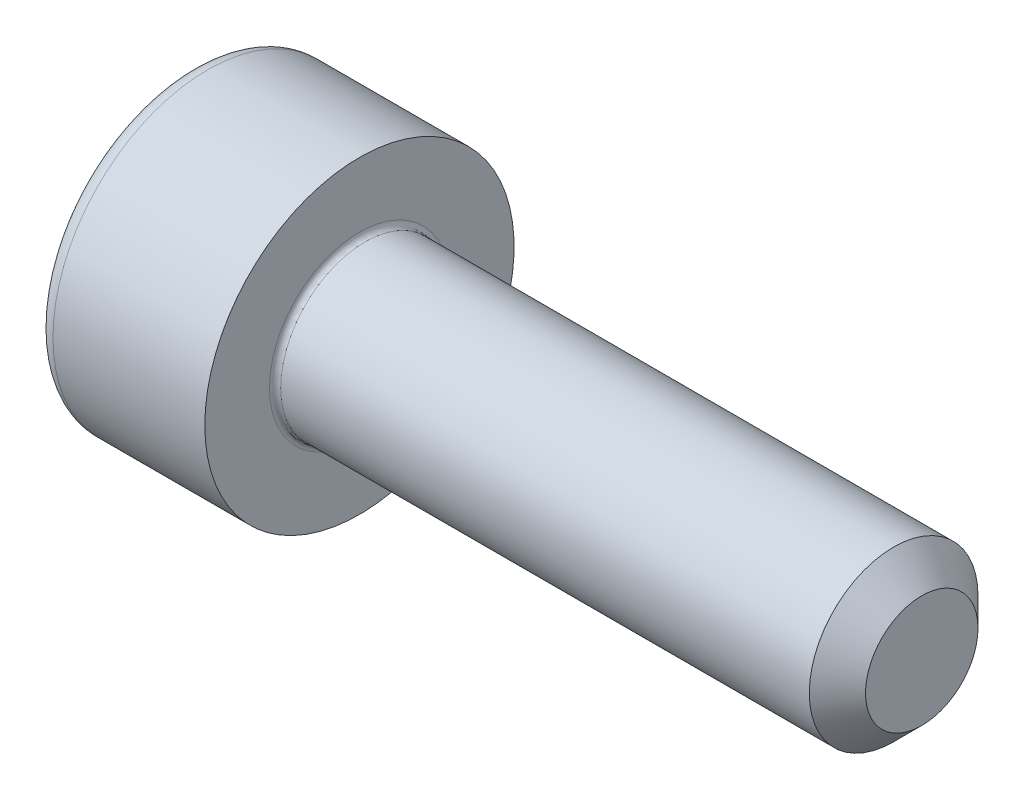
ISO-10303-21;
HEADER;
FILE_DESCRIPTION(('STEP AP214'),'2;1');
FILE_NAME('part.step','',(''),(''),'','','');
FILE_SCHEMA(('AUTOMOTIVE_DESIGN { 1 0 10303 214 1 1 1 1 }'));
ENDSEC;
DATA;
#1=APPLICATION_CONTEXT('core data for automotive mechanical design processes');
#2=APPLICATION_PROTOCOL_DEFINITION('international standard','automotive_design',2000,#1);
#3=PRODUCT_CONTEXT('',#1,'mechanical');
#4=PRODUCT('Part','Part','',(#3));
#5=PRODUCT_RELATED_PRODUCT_CATEGORY('part','',(#4));
#6=PRODUCT_DEFINITION_FORMATION('','',#4);
#7=PRODUCT_DEFINITION_CONTEXT('part definition',#1,'design');
#8=PRODUCT_DEFINITION('design','',#6,#7);
#9=PRODUCT_DEFINITION_SHAPE('','',#8);
#10=(LENGTH_UNIT() NAMED_UNIT(*) SI_UNIT(.MILLI.,.METRE.));
#11=(NAMED_UNIT(*) PLANE_ANGLE_UNIT() SI_UNIT($,.RADIAN.));
#12=(NAMED_UNIT(*) SI_UNIT($,.STERADIAN.) SOLID_ANGLE_UNIT());
#13=UNCERTAINTY_MEASURE_WITH_UNIT(LENGTH_MEASURE(1.E-05),#10,'distance_accuracy_value','');
#14=(GEOMETRIC_REPRESENTATION_CONTEXT(3) GLOBAL_UNCERTAINTY_ASSIGNED_CONTEXT((#13)) GLOBAL_UNIT_ASSIGNED_CONTEXT((#10,
#11,#12)) REPRESENTATION_CONTEXT('',''));
#15=CARTESIAN_POINT('',(0.,0.,0.));
#16=DIRECTION('',(0.,0.,1.));
#17=DIRECTION('',(1.,0.,0.));
#18=AXIS2_PLACEMENT_3D('',#15,#16,#17);
#19=CARTESIAN_POINT('',(0.1,0.,0.));
#20=DIRECTION('',(1.,0.,0.));
#21=DIRECTION('',(0.,-1.,0.));
#22=AXIS2_PLACEMENT_3D('',#19,#20,#21);
#23=TOROIDAL_SURFACE('',#22,1.6,0.1);
#24=CARTESIAN_POINT('',(0.,0.,0.));
#25=DIRECTION('',(1.,0.,0.));
#26=DIRECTION('',(0.,-1.,0.));
#27=AXIS2_PLACEMENT_3D('',#24,#25,#26);
#28=CIRCLE('',#27,1.6);
#29=CARTESIAN_POINT('',(0.,-1.6,0.));
#30=VERTEX_POINT('',#29);
#31=EDGE_CURVE('E210',#30,#30,#28,.T.);
#32=ORIENTED_EDGE('',*,*,#31,.T.);
#33=EDGE_LOOP('',(#32));
#34=FACE_BOUND('',#33,.T.);
#35=CARTESIAN_POINT('',(0.1,0.,0.));
#36=DIRECTION('',(-1.,0.,0.));
#37=DIRECTION('',(0.,0.,1.));
#38=AXIS2_PLACEMENT_3D('',#35,#36,#37);
#39=CIRCLE('',#38,1.5);
#40=CARTESIAN_POINT('',(0.1,0.,1.5));
#41=VERTEX_POINT('',#40);
#42=EDGE_CURVE('E211',#41,#41,#39,.T.);
#43=ORIENTED_EDGE('',*,*,#42,.T.);
#44=EDGE_LOOP('',(#43));
#45=FACE_BOUND('',#44,.T.);
#46=ADVANCED_FACE('F60',(#34,#45),#23,.F.);
#47=CARTESIAN_POINT('',(-2.7,0.,0.));
#48=DIRECTION('',(1.,0.,0.));
#49=DIRECTION('',(0.,0.,1.));
#50=AXIS2_PLACEMENT_3D('',#47,#48,#49);
#51=TOROIDAL_SURFACE('',#50,2.45,0.3);
#52=CARTESIAN_POINT('',(-3.,0.,0.));
#53=DIRECTION('',(1.,0.,0.));
#54=DIRECTION('',(0.,0.,1.));
#55=AXIS2_PLACEMENT_3D('',#52,#53,#54);
#56=CIRCLE('',#55,2.45);
#57=CARTESIAN_POINT('',(-3.,0.,2.45));
#58=VERTEX_POINT('',#57);
#59=EDGE_CURVE('E195',#58,#58,#56,.T.);
#60=ORIENTED_EDGE('',*,*,#59,.T.);
#61=EDGE_LOOP('',(#60));
#62=FACE_BOUND('',#61,.T.);
#63=CARTESIAN_POINT('',(-2.7,0.,0.));
#64=DIRECTION('',(1.,0.,0.));
#65=DIRECTION('',(0.,0.,1.));
#66=AXIS2_PLACEMENT_3D('',#63,#64,#65);
#67=CIRCLE('',#66,2.75);
#68=CARTESIAN_POINT('',(-2.7,0.,2.75));
#69=VERTEX_POINT('',#68);
#70=EDGE_CURVE('E201',#69,#69,#67,.T.);
#71=ORIENTED_EDGE('',*,*,#70,.F.);
#72=EDGE_LOOP('',(#71));
#73=FACE_BOUND('',#72,.T.);
#74=ADVANCED_FACE('F228',(#62,#73),#51,.T.);
#75=CARTESIAN_POINT('',(0.,0.,0.));
#76=DIRECTION('',(1.,0.,0.));
#77=DIRECTION('',(0.,0.,1.));
#78=AXIS2_PLACEMENT_3D('',#75,#76,#77);
#79=PLANE('',#78);
#80=ORIENTED_EDGE('',*,*,#31,.F.);
#81=EDGE_LOOP('',(#80));
#82=FACE_BOUND('',#81,.T.);
#83=CARTESIAN_POINT('',(0.,0.,0.));
#84=DIRECTION('',(1.,0.,0.));
#85=DIRECTION('',(0.,0.,1.));
#86=AXIS2_PLACEMENT_3D('',#83,#84,#85);
#87=CIRCLE('',#86,2.75);
#88=CARTESIAN_POINT('',(0.,0.,2.75));
#89=VERTEX_POINT('',#88);
#90=EDGE_CURVE('E197',#89,#89,#87,.T.);
#91=ORIENTED_EDGE('',*,*,#90,.T.);
#92=EDGE_LOOP('',(#91));
#93=FACE_BOUND('',#92,.T.);
#94=ADVANCED_FACE('F237',(#82,#93),#79,.T.);
#95=CARTESIAN_POINT('',(-3.,0.,0.));
#96=DIRECTION('',(1.,0.,0.));
#97=DIRECTION('',(0.,0.,1.));
#98=AXIS2_PLACEMENT_3D('',#95,#96,#97);
#99=CYLINDRICAL_SURFACE('',#98,2.75);
#100=ORIENTED_EDGE('',*,*,#70,.T.);
#101=EDGE_LOOP('',(#100));
#102=FACE_BOUND('',#101,.T.);
#103=ORIENTED_EDGE('',*,*,#90,.F.);
#104=EDGE_LOOP('',(#103));
#105=FACE_BOUND('',#104,.T.);
#106=ADVANCED_FACE('F265',(#102,#105),#99,.T.);
#107=CARTESIAN_POINT('',(0.133333333289239,-1.25,0.721687836487034));
#108=DIRECTION('',(0.,-0.5,0.866025403784439));
#109=DIRECTION('',(0.,0.866025403784439,0.5));
#110=AXIS2_PLACEMENT_3D('',#107,#108,#109);
#111=PLANE('',#110);
#112=CARTESIAN_POINT('',(-1.69999999999987,-1.25,0.721687836487035));
#113=CARTESIAN_POINT('',(-1.69738401948294,-1.24215203932499,0.726218858695339));
#114=CARTESIAN_POINT('',(-1.6922165499147,-1.22642783397098,0.735297232889276));
#115=CARTESIAN_POINT('',(-1.6846713619674,-1.20276898058198,0.748956678262127));
#116=CARTESIAN_POINT('',(-1.67733392896537,-1.17901516334059,0.762670951040728));
#117=CARTESIAN_POINT('',(-1.67021338001789,-1.15516514334506,0.776440766505325));
#118=CARTESIAN_POINT('',(-1.66253768859292,-1.12850348333736,0.791833883087814));
#119=CARTESIAN_POINT('',(-1.65367463731152,-1.09628003852828,0.810438097622551));
#120=CARTESIAN_POINT('',(-1.64360384312695,-1.05722065582976,0.832989042737921));
#121=CARTESIAN_POINT('',(-1.63372595374146,-1.01552255276089,0.857063453769432));
#122=CARTESIAN_POINT('',(-1.62415304160412,-0.971037529922755,0.882746893679936));
#123=CARTESIAN_POINT('',(-1.61437860911247,-0.920014398444216,0.912205112373968));
#124=CARTESIAN_POINT('',(-1.60493575093948,-0.861148465760758,0.94619137445486));
#125=CARTESIAN_POINT('',(-1.59763295469434,-0.802112128018892,0.980276019942097));
#126=CARTESIAN_POINT('',(-1.59322233484196,-0.753207018638113,1.00851139800784));
#127=CARTESIAN_POINT('',(-1.59067705349734,-0.71409478336521,1.03109285757126));
#128=CARTESIAN_POINT('',(-1.58915372065229,-0.679736799705594,1.05092944868595));
#129=CARTESIAN_POINT('',(-1.58834848889278,-0.644843445143961,1.07107513633504));
#130=CARTESIAN_POINT('',(-1.58829905866402,-0.609392767050834,1.09154259487506));
#131=CARTESIAN_POINT('',(-1.58903450088332,-0.573624128278051,1.11219362809907));
#132=CARTESIAN_POINT('',(-1.59056900030582,-0.537634757313027,1.13297210111369));
#133=CARTESIAN_POINT('',(-1.59289700232276,-0.501605681203261,1.15377349790432));
#134=CARTESIAN_POINT('',(-1.59601207891327,-0.465548040949067,1.17459138621142));
#135=CARTESIAN_POINT('',(-1.5999027213972,-0.429490466158829,1.19540923672289));
#136=CARTESIAN_POINT('',(-1.60455788341784,-0.393424641510312,1.21623185029226));
#137=CARTESIAN_POINT('',(-1.60995884670772,-0.357380152398952,1.2370421457835));
#138=CARTESIAN_POINT('',(-1.61608835380497,-0.321356169143508,1.25784060221332));
#139=CARTESIAN_POINT('',(-1.62292110031353,-0.285384285521163,1.27860897890593));
#140=CARTESIAN_POINT('',(-1.63043333920983,-0.249471247576269,1.29934338103084));
#141=CARTESIAN_POINT('',(-1.63859848012798,-0.213629543182003,1.32003659871108));
#142=CARTESIAN_POINT('',(-1.64739518608139,-0.17784538919857,1.34069658964614));
#143=CARTESIAN_POINT('',(-1.65679600883554,-0.142129567892932,1.36131712869128));
#144=CARTESIAN_POINT('',(-1.66677755965338,-0.10647502690417,1.38190228752897));
#145=CARTESIAN_POINT('',(-1.67731135856734,-0.0708929602258874,1.402445603304));
#146=CARTESIAN_POINT('',(-1.68837275186723,-0.0353810996675898,1.42294838555676));
#147=CARTESIAN_POINT('',(-1.69607201648135,-0.0117840267349489,1.43657216196651));
#148=CARTESIAN_POINT('',(-1.69999999999987,0.,1.44337567297407));
#149=B_SPLINE_CURVE_WITH_KNOTS('',3,(#112,#113,#114,#115,#116,#117,#118,#119,#120,#121,#122,
#123,#124,#125,#126,#127,#128,#129,#130,#131,#132,#133,#134,#135,#136,#137,#138,#139,#140,#141,
#142,#143,#144,#145,#146,#147,#148),.UNSPECIFIED.,.F.,.F.,(4,1,1,1,1,1,1,1,1,1,1,1,1,1,1,1,1,1,
1,1,1,1,1,1,1,1,1,1,1,1,1,1,1,1,4),(0.,0.0193286094422815,0.0386758778059963,0.0580433526518195,
0.0774601551828898,0.0969018530867074,0.122980681924948,0.155735511331439,0.191472868184122,
0.223581141428566,0.262696925229055,0.31374010739609,0.364073010828582,0.403001156408343,
0.429649119201364,0.456644552348079,0.48425991734535,0.51213956948865,0.54044675371789,
0.568839006632917,0.597298408954167,0.625777869427183,0.65433651245964,0.682914884875453,
0.711553298380966,0.740225079816359,0.768942792806602,0.797668936453434,0.826435603416019,
0.855234706304396,0.884091922636723,0.912980528265628,0.941935664746071,0.970940011129428,1.),.UNSPECIFIED.);
#150=CARTESIAN_POINT('',(-1.69999999999982,-1.25,0.721687836487035));
#151=VERTEX_POINT('',#150);
#152=CARTESIAN_POINT('',(-1.69999999999973,0.,1.44337567297407));
#153=VERTEX_POINT('',#152);
#154=EDGE_CURVE('E163',#151,#153,#149,.T.);
#155=ORIENTED_EDGE('',*,*,#154,.F.);
#156=DIRECTION('',(-1.,0.,0.));
#157=VECTOR('',#156,1.);
#158=CARTESIAN_POINT('',(-1.69999999999973,-1.25,0.721687836487034));
#159=LINE('',#158,#157);
#160=CARTESIAN_POINT('',(-3.,-1.25,0.721687836487033));
#161=VERTEX_POINT('',#160);
#162=EDGE_CURVE('E182',#151,#161,#159,.T.);
#163=ORIENTED_EDGE('',*,*,#162,.T.);
#164=DIRECTION('',(0.,0.866025403784439,0.5));
#165=VECTOR('',#164,1.);
#166=CARTESIAN_POINT('',(-3.,-1.25,0.721687836487034));
#167=LINE('',#166,#165);
#168=CARTESIAN_POINT('',(-3.,0.,1.44337567297407));
#169=VERTEX_POINT('',#168);
#170=EDGE_CURVE('E189',#161,#169,#167,.T.);
#171=ORIENTED_EDGE('',*,*,#170,.T.);
#172=DIRECTION('',(-1.,0.,0.));
#173=VECTOR('',#172,1.);
#174=CARTESIAN_POINT('',(-1.69999999999973,0.,1.44337567297407));
#175=LINE('',#174,#173);
#176=EDGE_CURVE('E126',#153,#169,#175,.T.);
#177=ORIENTED_EDGE('',*,*,#176,.F.);
#178=EDGE_LOOP('',(#155,#163,#171,#177));
#179=FACE_BOUND('',#178,.T.);
#180=ADVANCED_FACE('F258',(#179),#111,.F.);
#181=CARTESIAN_POINT('',(0.133333333289239,0.,1.44337567297407));
#182=DIRECTION('',(0.,0.5,0.866025403784439));
#183=DIRECTION('',(0.,0.866025403784439,-0.5));
#184=AXIS2_PLACEMENT_3D('',#181,#182,#183);
#185=PLANE('',#184);
#186=CARTESIAN_POINT('',(-1.69999999999987,0.,1.44337567297407));
#187=CARTESIAN_POINT('',(-1.69738401948294,0.00784796067500621,1.43884465076576));
#188=CARTESIAN_POINT('',(-1.6922165499147,0.0235721660290274,1.42976627657183));
#189=CARTESIAN_POINT('',(-1.6846713619674,0.0472310194180179,1.41610683119898));
#190=CARTESIAN_POINT('',(-1.67733392896537,0.0709848366594086,1.40239255842038));
#191=CARTESIAN_POINT('',(-1.67021338001789,0.0948348566549364,1.38862274295578));
#192=CARTESIAN_POINT('',(-1.66253768859292,0.121496516662632,1.3732296263733));
#193=CARTESIAN_POINT('',(-1.65367463731152,0.153719961471703,1.35462541183856));
#194=CARTESIAN_POINT('',(-1.64360384312696,0.192779344170216,1.3320744667232));
#195=CARTESIAN_POINT('',(-1.63372595374147,0.234477447239084,1.30800005569169));
#196=CARTESIAN_POINT('',(-1.62415304160413,0.278962470077212,1.28231661578119));
#197=CARTESIAN_POINT('',(-1.61437860911248,0.329985601555743,1.25285839708716));
#198=CARTESIAN_POINT('',(-1.60493575093949,0.38885153423919,1.21887213500627));
#199=CARTESIAN_POINT('',(-1.59763295469434,0.447887871981046,1.18478748951904));
#200=CARTESIAN_POINT('',(-1.59322233484197,0.496792981361817,1.15655211145331));
#201=CARTESIAN_POINT('',(-1.59067705349735,0.535905216634715,1.13397065188989));
#202=CARTESIAN_POINT('',(-1.58915372065229,0.570263200294327,1.1141340607752));
#203=CARTESIAN_POINT('',(-1.58834848889279,0.605156554855955,1.09398837312612));
#204=CARTESIAN_POINT('',(-1.58829905866402,0.640607232949079,1.0735209145861));
#205=CARTESIAN_POINT('',(-1.58903450088332,0.676375871721859,1.05286988136209));
#206=CARTESIAN_POINT('',(-1.59056900030581,0.712365242686879,1.03209140834747));
#207=CARTESIAN_POINT('',(-1.59289700232275,0.748394318796646,1.01129001155684));
#208=CARTESIAN_POINT('',(-1.59601207891326,0.784451959050839,0.990472123249737));
#209=CARTESIAN_POINT('',(-1.59990272139718,0.820509533841079,0.969654272738267));
#210=CARTESIAN_POINT('',(-1.60455788341783,0.856575358489599,0.948831659168899));
#211=CARTESIAN_POINT('',(-1.6099588467077,0.892619847600962,0.92802136367765));
#212=CARTESIAN_POINT('',(-1.61608835380496,0.928643830856412,0.907222907247834));
#213=CARTESIAN_POINT('',(-1.62292110031352,0.964615714478762,0.886454530555211));
#214=CARTESIAN_POINT('',(-1.63043333920981,1.00052875242366,0.865720128430306));
#215=CARTESIAN_POINT('',(-1.63859848012796,1.03637045681794,0.845026910750056));
#216=CARTESIAN_POINT('',(-1.64739518608137,1.07215461080138,0.824366919814993));
#217=CARTESIAN_POINT('',(-1.65679600883552,1.10787043210703,0.803746380769848));
#218=CARTESIAN_POINT('',(-1.66677755965337,1.1435249730958,0.783161221932148));
#219=CARTESIAN_POINT('',(-1.67731135856734,1.17910703977409,0.762617906157113));
#220=CARTESIAN_POINT('',(-1.68837275186723,1.2146189003324,0.742115123904349));
#221=CARTESIAN_POINT('',(-1.69607201648135,1.23821597326505,0.728491347494598));
#222=CARTESIAN_POINT('',(-1.69999999999986,1.25,0.721687836487037));
#223=B_SPLINE_CURVE_WITH_KNOTS('',3,(#186,#187,#188,#189,#190,#191,#192,#193,#194,#195,#196,
#197,#198,#199,#200,#201,#202,#203,#204,#205,#206,#207,#208,#209,#210,#211,#212,#213,#214,#215,
#216,#217,#218,#219,#220,#221,#222),.UNSPECIFIED.,.F.,.F.,(4,1,1,1,1,1,1,1,1,1,1,1,1,1,1,1,1,1,
1,1,1,1,1,1,1,1,1,1,1,1,1,1,1,1,4),(0.,0.0193286094422852,0.038675877805997,0.0580433526518165,
0.0774601551828836,0.096901853086698,0.122980681924932,0.155735511331419,0.191472868184097,
0.223581141428535,0.26269692522902,0.313740107396046,0.364073010828529,0.403001156408285,
0.429649119201302,0.456644552348014,0.484259917345281,0.512139569488578,0.540446753717816,
0.56883900663284,0.59729840895409,0.625777869427106,0.654336512459564,0.68291488487538,
0.711553298380895,0.740225079816292,0.768942792806539,0.797668936453377,0.82643560341597,
0.855234706304354,0.884091922636689,0.912980528265602,0.941935664746054,0.97094001112942,1.),.UNSPECIFIED.);
#224=CARTESIAN_POINT('',(-1.69999999999981,1.25,0.721687836487036));
#225=VERTEX_POINT('',#224);
#226=EDGE_CURVE('E161',#153,#225,#223,.T.);
#227=ORIENTED_EDGE('',*,*,#226,.F.);
#228=ORIENTED_EDGE('',*,*,#176,.T.);
#229=DIRECTION('',(0.,0.866025403784439,-0.5));
#230=VECTOR('',#229,1.);
#231=CARTESIAN_POINT('',(-3.,0.,1.44337567297407));
#232=LINE('',#231,#230);
#233=CARTESIAN_POINT('',(-3.,1.25,0.721687836487037));
#234=VERTEX_POINT('',#233);
#235=EDGE_CURVE('E134',#169,#234,#232,.T.);
#236=ORIENTED_EDGE('',*,*,#235,.T.);
#237=DIRECTION('',(-1.,0.,0.));
#238=VECTOR('',#237,1.);
#239=CARTESIAN_POINT('',(-1.69999999999973,1.25,0.721687836487036));
#240=LINE('',#239,#238);
#241=EDGE_CURVE('E116',#225,#234,#240,.T.);
#242=ORIENTED_EDGE('',*,*,#241,.F.);
#243=EDGE_LOOP('',(#227,#228,#236,#242));
#244=FACE_BOUND('',#243,.T.);
#245=ADVANCED_FACE('F133',(#244),#185,.F.);
#246=CARTESIAN_POINT('',(0.133333333289239,1.25,0.721687836487036));
#247=DIRECTION('',(0.,1.,0.));
#248=DIRECTION('',(0.,0.,-1.));
#249=AXIS2_PLACEMENT_3D('',#246,#247,#248);
#250=PLANE('',#249);
#251=CARTESIAN_POINT('',(-1.69999999999986,1.25,0.721687836487036));
#252=CARTESIAN_POINT('',(-1.69738401948294,1.25,0.712625792070429));
#253=CARTESIAN_POINT('',(-1.6922165499147,1.25,0.694469043682561));
#254=CARTESIAN_POINT('',(-1.6846713619674,1.25,0.667150152936864));
#255=CARTESIAN_POINT('',(-1.67733392896537,1.25,0.639721607379672));
#256=CARTESIAN_POINT('',(-1.67021338001789,1.25,0.612181976450485));
#257=CARTESIAN_POINT('',(-1.66253768859292,1.25,0.581395743285518));
#258=CARTESIAN_POINT('',(-1.65367463731153,1.25,0.544187314216054));
#259=CARTESIAN_POINT('',(-1.64360384312696,1.25,0.499085423985328));
#260=CARTESIAN_POINT('',(-1.63372595374147,1.25,0.450936601922322));
#261=CARTESIAN_POINT('',(-1.62415304160414,1.25,0.399569722101333));
#262=CARTESIAN_POINT('',(-1.61437860911249,1.25,0.340653284713289));
#263=CARTESIAN_POINT('',(-1.6049357509395,1.25,0.272680760551531));
#264=CARTESIAN_POINT('',(-1.59763295469435,1.25,0.204511469577086));
#265=CARTESIAN_POINT('',(-1.59322233484197,1.25,0.148040713445626));
#266=CARTESIAN_POINT('',(-1.59067705349735,1.25,0.102877794318804));
#267=CARTESIAN_POINT('',(-1.58915372065229,1.25,0.0632046120894322));
#268=CARTESIAN_POINT('',(-1.58834848889278,1.25,0.0229132367912671));
#269=CARTESIAN_POINT('',(-1.58829905866402,1.25,-0.0180216802887679));
#270=CARTESIAN_POINT('',(-1.58903450088331,1.25,-0.0593237467367864));
#271=CARTESIAN_POINT('',(-1.5905690003058,1.25,-0.100880692766023));
#272=CARTESIAN_POINT('',(-1.59289700232274,1.25,-0.142483486347277));
#273=CARTESIAN_POINT('',(-1.59601207891324,1.25,-0.18411926296148));
#274=CARTESIAN_POINT('',(-1.59990272139717,1.25,-0.225754963984424));
#275=CARTESIAN_POINT('',(-1.60455788341781,1.25,-0.267400191123166));
#276=CARTESIAN_POINT('',(-1.60995884670768,1.25,-0.309020782105669));
#277=CARTESIAN_POINT('',(-1.61608835380494,1.25,-0.350617694965311));
#278=CARTESIAN_POINT('',(-1.6229211003135,1.25,-0.392154448350565));
#279=CARTESIAN_POINT('',(-1.63043333920979,1.25,-0.433623252600389));
#280=CARTESIAN_POINT('',(-1.63859848012794,1.25,-0.475009687960901));
#281=CARTESIAN_POINT('',(-1.64739518608136,1.25,-0.516329669831042));
#282=CARTESIAN_POINT('',(-1.65679600883551,1.25,-0.557570747921346));
#283=CARTESIAN_POINT('',(-1.66677755965335,1.25,-0.598741065596762));
#284=CARTESIAN_POINT('',(-1.67731135856733,1.25,-0.63982769714685));
#285=CARTESIAN_POINT('',(-1.68837275186722,1.25,-0.680833261652393));
#286=CARTESIAN_POINT('',(-1.69607201648135,1.25,-0.708080814471907));
#287=CARTESIAN_POINT('',(-1.69999999999986,1.25,-0.721687836487034));
#288=B_SPLINE_CURVE_WITH_KNOTS('',3,(#251,#252,#253,#254,#255,#256,#257,#258,#259,#260,#261,
#262,#263,#264,#265,#266,#267,#268,#269,#270,#271,#272,#273,#274,#275,#276,#277,#278,#279,#280,
#281,#282,#283,#284,#285,#286,#287),.UNSPECIFIED.,.F.,.F.,(4,1,1,1,1,1,1,1,1,1,1,1,1,1,1,1,1,1,
1,1,1,1,1,1,1,1,1,1,1,1,1,1,1,1,4),(0.,0.0193286094422788,0.0386758778059875,0.0580433526518041,
0.0774601551828686,0.0969018530866802,0.122980681924911,0.155735511331393,0.191472868184064,
0.223581141428496,0.262696925228972,0.313740107395987,0.364073010828459,0.403001156408204,
0.429649119201216,0.456644552347923,0.484259917345186,0.51213956948848,0.540446753717715,
0.568839006632737,0.597298408953986,0.625777869427002,0.654336512459462,0.68291488487528,
0.7115532983808,0.740225079816202,0.768942792806457,0.797668936453302,0.826435603415904,
0.855234706304297,0.884091922636643,0.912980528265567,0.941935664746031,0.970940011129409,1.),.UNSPECIFIED.);
#289=CARTESIAN_POINT('',(-1.69999999999981,1.25,-0.721687836487034));
#290=VERTEX_POINT('',#289);
#291=EDGE_CURVE('E121',#225,#290,#288,.T.);
#292=ORIENTED_EDGE('',*,*,#291,.F.);
#293=ORIENTED_EDGE('',*,*,#241,.T.);
#294=DIRECTION('',(0.,0.,-1.));
#295=VECTOR('',#294,1.);
#296=CARTESIAN_POINT('',(-3.,1.25,0.721687836487036));
#297=LINE('',#296,#295);
#298=CARTESIAN_POINT('',(-3.,1.25,-0.721687836487035));
#299=VERTEX_POINT('',#298);
#300=EDGE_CURVE('E120',#234,#299,#297,.T.);
#301=ORIENTED_EDGE('',*,*,#300,.T.);
#302=DIRECTION('',(-1.,0.,0.));
#303=VECTOR('',#302,1.);
#304=CARTESIAN_POINT('',(-1.69999999999973,1.25,-0.721687836487034));
#305=LINE('',#304,#303);
#306=EDGE_CURVE('E129',#290,#299,#305,.T.);
#307=ORIENTED_EDGE('',*,*,#306,.F.);
#308=EDGE_LOOP('',(#292,#293,#301,#307));
#309=FACE_BOUND('',#308,.T.);
#310=ADVANCED_FACE('F119',(#309),#250,.F.);
#311=CARTESIAN_POINT('',(0.133333333289239,1.25,-0.721687836487034));
#312=DIRECTION('',(0.,0.5,-0.866025403784439));
#313=DIRECTION('',(0.,-0.866025403784439,-0.5));
#314=AXIS2_PLACEMENT_3D('',#311,#312,#313);
#315=PLANE('',#314);
#316=CARTESIAN_POINT('',(-1.69999999999986,1.25,-0.721687836487034));
#317=CARTESIAN_POINT('',(-1.69738401948294,1.24215203932499,-0.726218858695339));
#318=CARTESIAN_POINT('',(-1.6922165499147,1.22642783397097,-0.735297232889276));
#319=CARTESIAN_POINT('',(-1.6846713619674,1.20276898058198,-0.748956678262131));
#320=CARTESIAN_POINT('',(-1.67733392896536,1.17901516334058,-0.762670951040733));
#321=CARTESIAN_POINT('',(-1.67021338001788,1.15516514334504,-0.776440766505336));
#322=CARTESIAN_POINT('',(-1.66253768859291,1.12850348333733,-0.791833883087827));
#323=CARTESIAN_POINT('',(-1.65367463731151,1.09628003852824,-0.81043809762257));
#324=CARTESIAN_POINT('',(-1.64360384312694,1.05722065582971,-0.832989042737947));
#325=CARTESIAN_POINT('',(-1.63372595374144,1.01552255276083,-0.857063453769465));
#326=CARTESIAN_POINT('',(-1.62415304160411,0.971037529922679,-0.882746893679978));
#327=CARTESIAN_POINT('',(-1.61437860911245,0.920014398444122,-0.91220511237402));
#328=CARTESIAN_POINT('',(-1.60493575093946,0.861148465760644,-0.946191374454924));
#329=CARTESIAN_POINT('',(-1.59763295469432,0.802112128018757,-0.980276019942171));
#330=CARTESIAN_POINT('',(-1.59322233484195,0.753207018637962,-1.00851139800792));
#331=CARTESIAN_POINT('',(-1.59067705349733,0.714094783365046,-1.03109285757135));
#332=CARTESIAN_POINT('',(-1.58915372065228,0.67973679970542,-1.05092944868605));
#333=CARTESIAN_POINT('',(-1.58834848889278,0.644843445143779,-1.07107513633514));
#334=CARTESIAN_POINT('',(-1.58829905866403,0.609392767050644,-1.09154259487516));
#335=CARTESIAN_POINT('',(-1.58903450088333,0.573624128277854,-1.11219362809918));
#336=CARTESIAN_POINT('',(-1.59056900030583,0.537634757312828,-1.1329721011138));
#337=CARTESIAN_POINT('',(-1.59289700232277,0.501605681203059,-1.15377349790443));
#338=CARTESIAN_POINT('',(-1.59601207891328,0.465548040948867,-1.17459138621153));
#339=CARTESIAN_POINT('',(-1.59990272139722,0.429490466158631,-1.195409236723));
#340=CARTESIAN_POINT('',(-1.60455788341786,0.393424641510121,-1.21623185029236));
#341=CARTESIAN_POINT('',(-1.60995884670774,0.357380152398769,-1.23704214578361));
#342=CARTESIAN_POINT('',(-1.616088353805,0.321356169143335,-1.25784060221341));
#343=CARTESIAN_POINT('',(-1.62292110031356,0.285384285521004,-1.27860897890602));
#344=CARTESIAN_POINT('',(-1.63043333920986,0.249471247576124,-1.29934338103092));
#345=CARTESIAN_POINT('',(-1.63859848012801,0.213629543181873,-1.32003659871115));
#346=CARTESIAN_POINT('',(-1.64739518608141,0.177845389198457,-1.3406965896462));
#347=CARTESIAN_POINT('',(-1.65679600883556,0.142129567892837,-1.36131712869133));
#348=CARTESIAN_POINT('',(-1.66677755965339,0.106475026904096,-1.38190228752901));
#349=CARTESIAN_POINT('',(-1.67731135856736,0.0708929602258341,-1.40244560330403));
#350=CARTESIAN_POINT('',(-1.68837275186724,0.0353810996675606,-1.42294838555677));
#351=CARTESIAN_POINT('',(-1.69607201648136,0.0117840267349361,-1.43657216196651));
#352=CARTESIAN_POINT('',(-1.69999999999986,0.,-1.44337567297406));
#353=B_SPLINE_CURVE_WITH_KNOTS('',3,(#316,#317,#318,#319,#320,#321,#322,#323,#324,#325,#326,
#327,#328,#329,#330,#331,#332,#333,#334,#335,#336,#337,#338,#339,#340,#341,#342,#343,#344,#345,
#346,#347,#348,#349,#350,#351,#352),.UNSPECIFIED.,.F.,.F.,(4,1,1,1,1,1,1,1,1,1,1,1,1,1,1,1,1,1,
1,1,1,1,1,1,1,1,1,1,1,1,1,1,1,1,4),(0.,0.0193286094422844,0.038675877806003,0.0580433526518305,
0.0774601551829062,0.09690185308673,0.122980681924976,0.155735511331478,0.191472868184172,
0.223581141428625,0.262696925229127,0.31374010739618,0.364073010828688,0.403001156408462,
0.429649119201491,0.456644552348215,0.484259917345492,0.512139569488797,0.540446753718042,
0.568839006633072,0.597298408954323,0.625777869427339,0.654336512459793,0.682914884875602,
0.711553298381108,0.740225079816493,0.768942792806725,0.797668936453546,0.82643560341612,
0.855234706304484,0.884091922636796,0.912980528265685,0.941935664746111,0.97094001112945,1.),.UNSPECIFIED.);
#354=CARTESIAN_POINT('',(-1.69999999999973,0.,-1.44337567297406));
#355=VERTEX_POINT('',#354);
#356=EDGE_CURVE('E354',#290,#355,#353,.T.);
#357=ORIENTED_EDGE('',*,*,#356,.F.);
#358=ORIENTED_EDGE('',*,*,#306,.T.);
#359=DIRECTION('',(0.,-0.866025403784439,-0.5));
#360=VECTOR('',#359,1.);
#361=CARTESIAN_POINT('',(-3.,1.25,-0.721687836487034));
#362=LINE('',#361,#360);
#363=CARTESIAN_POINT('',(-3.,0.,-1.44337567297406));
#364=VERTEX_POINT('',#363);
#365=EDGE_CURVE('E148',#299,#364,#362,.T.);
#366=ORIENTED_EDGE('',*,*,#365,.T.);
#367=DIRECTION('',(-1.,0.,0.));
#368=VECTOR('',#367,1.);
#369=CARTESIAN_POINT('',(-1.69999999999973,0.,-1.44337567297406));
#370=LINE('',#369,#368);
#371=EDGE_CURVE('E159',#355,#364,#370,.T.);
#372=ORIENTED_EDGE('',*,*,#371,.F.);
#373=EDGE_LOOP('',(#357,#358,#366,#372));
#374=FACE_BOUND('',#373,.T.);
#375=ADVANCED_FACE('F246',(#374),#315,.F.);
#376=CARTESIAN_POINT('',(0.133333333289239,0.,-1.44337567297406));
#377=DIRECTION('',(0.,-0.5,-0.866025403784438));
#378=DIRECTION('',(0.,-0.866025403784438,0.5));
#379=AXIS2_PLACEMENT_3D('',#376,#377,#378);
#380=PLANE('',#379);
#381=CARTESIAN_POINT('',(-1.69999999999986,0.,-1.44337567297406));
#382=CARTESIAN_POINT('',(-1.69738401948294,-0.00784796067500364,-1.43884465076576));
#383=CARTESIAN_POINT('',(-1.6922165499147,-0.0235721660290173,-1.42976627657183));
#384=CARTESIAN_POINT('',(-1.6846713619674,-0.047231019418001,-1.41610683119898));
#385=CARTESIAN_POINT('',(-1.67733392896537,-0.0709848366593899,-1.40239255842038));
#386=CARTESIAN_POINT('',(-1.67021338001789,-0.0948348566549163,-1.38862274295579));
#387=CARTESIAN_POINT('',(-1.66253768859292,-0.121496516662611,-1.3732296263733));
#388=CARTESIAN_POINT('',(-1.65367463731153,-0.153719961471681,-1.35462541183857));
#389=CARTESIAN_POINT('',(-1.64360384312696,-0.192779344170191,-1.3320744667232));
#390=CARTESIAN_POINT('',(-1.63372595374147,-0.234477447239055,-1.3080000556917));
#391=CARTESIAN_POINT('',(-1.62415304160413,-0.27896247007718,-1.2823166157812));
#392=CARTESIAN_POINT('',(-1.61437860911248,-0.329985601555706,-1.25285839708718));
#393=CARTESIAN_POINT('',(-1.60493575093949,-0.388851534239146,-1.21887213500629));
#394=CARTESIAN_POINT('',(-1.59763295469434,-0.447887871980996,-1.18478748951907));
#395=CARTESIAN_POINT('',(-1.59322233484197,-0.496792981361762,-1.15655211145333));
#396=CARTESIAN_POINT('',(-1.59067705349735,-0.535905216634655,-1.13397065188992));
#397=CARTESIAN_POINT('',(-1.58915372065229,-0.570263200294263,-1.11413406077523));
#398=CARTESIAN_POINT('',(-1.58834848889278,-0.605156554855889,-1.09398837312615));
#399=CARTESIAN_POINT('',(-1.58829905866402,-0.640607232949011,-1.07352091458613));
#400=CARTESIAN_POINT('',(-1.58903450088332,-0.67637587172179,-1.05286988136212));
#401=CARTESIAN_POINT('',(-1.5905690003058,-0.712365242686809,-1.0320914083475));
#402=CARTESIAN_POINT('',(-1.59289700232274,-0.748394318796576,-1.01129001155687));
#403=CARTESIAN_POINT('',(-1.59601207891325,-0.784451959050769,-0.990472123249772));
#404=CARTESIAN_POINT('',(-1.59990272139717,-0.820509533841012,-0.9696542727383));
#405=CARTESIAN_POINT('',(-1.60455788341782,-0.856575358489533,-0.94883165916893));
#406=CARTESIAN_POINT('',(-1.60995884670769,-0.892619847600901,-0.92802136367768));
#407=CARTESIAN_POINT('',(-1.61608835380495,-0.928643830856355,-0.907222907247861));
#408=CARTESIAN_POINT('',(-1.62292110031351,-0.964615714478711,-0.886454530555236));
#409=CARTESIAN_POINT('',(-1.6304333392098,-1.00052875242362,-0.865720128430327));
#410=CARTESIAN_POINT('',(-1.63859848012795,-1.0363704568179,-0.845026910750073));
#411=CARTESIAN_POINT('',(-1.64739518608136,-1.07215461080135,-0.824366919815006));
#412=CARTESIAN_POINT('',(-1.65679600883552,-1.107870432107,-0.803746380769857));
#413=CARTESIAN_POINT('',(-1.66677755965336,-1.14352497309578,-0.783161221932152));
#414=CARTESIAN_POINT('',(-1.67731135856733,-1.17910703977408,-0.762617906157112));
#415=CARTESIAN_POINT('',(-1.68837275186723,-1.2146189003324,-0.742115123904345));
#416=CARTESIAN_POINT('',(-1.69607201648135,-1.23821597326505,-0.728491347494592));
#417=CARTESIAN_POINT('',(-1.69999999999986,-1.25,-0.72168783648703));
#418=B_SPLINE_CURVE_WITH_KNOTS('',3,(#381,#382,#383,#384,#385,#386,#387,#388,#389,#390,#391,
#392,#393,#394,#395,#396,#397,#398,#399,#400,#401,#402,#403,#404,#405,#406,#407,#408,#409,#410,
#411,#412,#413,#414,#415,#416,#417),.UNSPECIFIED.,.F.,.F.,(4,1,1,1,1,1,1,1,1,1,1,1,1,1,1,1,1,1,
1,1,1,1,1,1,1,1,1,1,1,1,1,1,1,1,4),(0.,0.019328609442274,0.0386758778059845,0.0580433526518032,
0.0774601551828703,0.0969018530866851,0.122980681924919,0.155735511331404,0.191472868184079,
0.223581141428515,0.262696925228994,0.313740107396015,0.364073010828492,0.403001156408242,
0.429649119201256,0.456644552347965,0.48425991734523,0.512139569488526,0.540446753717762,
0.568839006632785,0.597298408954035,0.625777869427051,0.65433651245951,0.682914884875327,
0.711553298380845,0.740225079816245,0.768942792806496,0.797668936453339,0.826435603415936,
0.855234706304325,0.884091922636666,0.912980528265586,0.941935664746044,0.970940011129416,1.),.UNSPECIFIED.);
#419=CARTESIAN_POINT('',(-1.69999999999981,-1.25,-0.721687836487031));
#420=VERTEX_POINT('',#419);
#421=EDGE_CURVE('E341',#355,#420,#418,.T.);
#422=ORIENTED_EDGE('',*,*,#421,.F.);
#423=ORIENTED_EDGE('',*,*,#371,.T.);
#424=DIRECTION('',(0.,-0.866025403784438,0.5));
#425=VECTOR('',#424,1.);
#426=CARTESIAN_POINT('',(-3.,0.,-1.44337567297406));
#427=LINE('',#426,#425);
#428=CARTESIAN_POINT('',(-3.,-1.25,-0.721687836487028));
#429=VERTEX_POINT('',#428);
#430=EDGE_CURVE('E151',#364,#429,#427,.T.);
#431=ORIENTED_EDGE('',*,*,#430,.T.);
#432=DIRECTION('',(-1.,0.,0.));
#433=VECTOR('',#432,1.);
#434=CARTESIAN_POINT('',(-1.69999999999973,-1.25,-0.721687836487031));
#435=LINE('',#434,#433);
#436=EDGE_CURVE('E187',#420,#429,#435,.T.);
#437=ORIENTED_EDGE('',*,*,#436,.F.);
#438=EDGE_LOOP('',(#422,#423,#431,#437));
#439=FACE_BOUND('',#438,.T.);
#440=ADVANCED_FACE('F245',(#439),#380,.F.);
#441=CARTESIAN_POINT('',(0.133333333289239,-1.25,-0.721687836487031));
#442=DIRECTION('',(0.,-1.,0.));
#443=DIRECTION('',(0.,0.,1.));
#444=AXIS2_PLACEMENT_3D('',#441,#442,#443);
#445=PLANE('',#444);
#446=CARTESIAN_POINT('',(-1.69999999999986,-1.25,-0.72168783648703));
#447=CARTESIAN_POINT('',(-1.68952620537607,-1.25000000098073,-0.685402704109452));
#448=CARTESIAN_POINT('',(-1.66882662532746,-1.25000000047391,-0.609426524114409));
#449=CARTESIAN_POINT('',(-1.64216462328561,-1.24999999653124,-0.495567471339054));
#450=CARTESIAN_POINT('',(-1.62091524111501,-1.25000000079919,-0.384284635832132));
#451=CARTESIAN_POINT('',(-1.60602622647925,-1.24999999982635,-0.283416065071795));
#452=CARTESIAN_POINT('',(-1.59595460164164,-1.25000000004584,-0.18912397710867));
#453=CARTESIAN_POINT('',(-1.58979451832237,-1.2499999999877,-0.096121255574874));
#454=CARTESIAN_POINT('',(-1.58834722259695,-1.24999999999578,-0.0325311952212167));
#455=CARTESIAN_POINT('',(-1.58835450315953,-1.24999999999987,0.));
#456=B_SPLINE_CURVE_WITH_KNOTS('',3,(#446,#447,#448,#449,#450,#451,#452,#453,#454,#455),
.UNSPECIFIED.,.F.,.F.,(4,1,1,1,1,1,1,4),(0.,0.15464663082682,0.32233761678327,0.478698544215034,
0.61840543615109,0.739680361911978,0.866888771115841,1.),.UNSPECIFIED.);
#457=CARTESIAN_POINT('',(-1.58835450315953,-1.24999999999987,0.));
#458=VERTEX_POINT('',#457);
#459=EDGE_CURVE('E352',#420,#458,#456,.T.);
#460=ORIENTED_EDGE('',*,*,#459,.F.);
#461=ORIENTED_EDGE('',*,*,#436,.T.);
#462=DIRECTION('',(0.,0.,1.));
#463=VECTOR('',#462,1.);
#464=CARTESIAN_POINT('',(-3.,-1.25,-0.721687836487031));
#465=LINE('',#464,#463);
#466=EDGE_CURVE('E193',#429,#161,#465,.T.);
#467=ORIENTED_EDGE('',*,*,#466,.T.);
#468=ORIENTED_EDGE('',*,*,#162,.F.);
#469=CARTESIAN_POINT('',(-1.58835450315953,-1.24999999999987,0.));
#470=CARTESIAN_POINT('',(-1.58834655337041,-1.24999999999995,0.0332113064453385));
#471=CARTESIAN_POINT('',(-1.58986890770249,-1.25000000000002,0.0986999582225013));
#472=CARTESIAN_POINT('',(-1.5964399058259,-1.25,0.195338682543529));
#473=CARTESIAN_POINT('',(-1.60788370358651,-1.25,0.298925607584719));
#474=CARTESIAN_POINT('',(-1.62512567463451,-1.25,0.409278174253511));
#475=CARTESIAN_POINT('',(-1.64887876229215,-1.25,0.526138809119023));
#476=CARTESIAN_POINT('',(-1.67430736459291,-1.25,0.629971803135887));
#477=CARTESIAN_POINT('',(-1.69219697844036,-1.25,0.694656343300826));
#478=CARTESIAN_POINT('',(-1.69999999999987,-1.25,0.721687836487035));
#479=B_SPLINE_CURVE_WITH_KNOTS('',3,(#469,#470,#471,#472,#473,#474,#475,#476,#477,#478),
.UNSPECIFIED.,.F.,.F.,(4,1,1,1,1,1,1,4),(0.,0.135881251771568,0.268088734046202,
0.396575364343073,0.562487499680676,0.725224599421058,0.884758394713962,1.),.UNSPECIFIED.);
#480=EDGE_CURVE('E137',#458,#151,#479,.T.);
#481=ORIENTED_EDGE('',*,*,#480,.F.);
#482=EDGE_LOOP('',(#460,#461,#467,#468,#481));
#483=FACE_BOUND('',#482,.T.);
#484=ADVANCED_FACE('F242',(#483),#445,.F.);
#485=CARTESIAN_POINT('',(-1.28333333335538,0.,0.));
#486=DIRECTION('',(-1.,0.,0.));
#487=DIRECTION('',(0.,1.,0.));
#488=AXIS2_PLACEMENT_3D('',#485,#486,#487);
#489=CONICAL_SURFACE('',#488,0.721687836487032,1.04719755121951);
#490=CARTESIAN_POINT('',(-0.866666666710761,0.,0.));
#491=VERTEX_POINT('',#490);
#492=VERTEX_LOOP('',#491);
#493=FACE_BOUND('',#492,.T.);
#494=ORIENTED_EDGE('',*,*,#480,.T.);
#495=ORIENTED_EDGE('',*,*,#154,.T.);
#496=ORIENTED_EDGE('',*,*,#226,.T.);
#497=ORIENTED_EDGE('',*,*,#291,.T.);
#498=ORIENTED_EDGE('',*,*,#356,.T.);
#499=ORIENTED_EDGE('',*,*,#421,.T.);
#500=ORIENTED_EDGE('',*,*,#459,.T.);
#501=EDGE_LOOP('',(#494,#495,#496,#497,#498,#499,#500));
#502=FACE_BOUND('',#501,.T.);
#503=ADVANCED_FACE('F243',(#493,#502),#489,.F.);
#504=CARTESIAN_POINT('',(-3.,0.,0.));
#505=DIRECTION('',(-1.,0.,0.));
#506=DIRECTION('',(0.,0.,1.));
#507=AXIS2_PLACEMENT_3D('',#504,#505,#506);
#508=PLANE('',#507);
#509=ORIENTED_EDGE('',*,*,#170,.F.);
#510=ORIENTED_EDGE('',*,*,#466,.F.);
#511=ORIENTED_EDGE('',*,*,#430,.F.);
#512=ORIENTED_EDGE('',*,*,#365,.F.);
#513=ORIENTED_EDGE('',*,*,#300,.F.);
#514=ORIENTED_EDGE('',*,*,#235,.F.);
#515=EDGE_LOOP('',(#509,#510,#511,#512,#513,#514));
#516=FACE_BOUND('',#515,.T.);
#517=ORIENTED_EDGE('',*,*,#59,.F.);
#518=EDGE_LOOP('',(#517));
#519=FACE_BOUND('',#518,.T.);
#520=ADVANCED_FACE('F142',(#516,#519),#508,.T.);
#521=CARTESIAN_POINT('',(10.,0.,0.));
#522=DIRECTION('',(-1.,0.,0.));
#523=DIRECTION('',(0.,0.,1.));
#524=AXIS2_PLACEMENT_3D('',#521,#522,#523);
#525=CYLINDRICAL_SURFACE('',#524,1.5);
#526=CARTESIAN_POINT('',(9.5,0.,0.));
#527=DIRECTION('',(1.,0.,0.));
#528=DIRECTION('',(0.,0.,-1.));
#529=AXIS2_PLACEMENT_3D('',#526,#527,#528);
#530=CIRCLE('',#529,1.5);
#531=CARTESIAN_POINT('',(9.5,0.,-1.5));
#532=VERTEX_POINT('',#531);
#533=EDGE_CURVE('E11',#532,#532,#530,.F.);
#534=ORIENTED_EDGE('',*,*,#533,.T.);
#535=EDGE_LOOP('',(#534));
#536=FACE_BOUND('',#535,.T.);
#537=ORIENTED_EDGE('',*,*,#42,.F.);
#538=EDGE_LOOP('',(#537));
#539=FACE_BOUND('',#538,.T.);
#540=ADVANCED_FACE('F223',(#536,#539),#525,.T.);
#541=CARTESIAN_POINT('',(10.,0.,0.));
#542=DIRECTION('',(1.,0.,0.));
#543=DIRECTION('',(0.,0.,-1.));
#544=AXIS2_PLACEMENT_3D('',#541,#542,#543);
#545=PLANE('',#544);
#546=CARTESIAN_POINT('',(10.,0.,0.));
#547=DIRECTION('',(1.,0.,0.));
#548=DIRECTION('',(0.,0.,-1.));
#549=AXIS2_PLACEMENT_3D('',#546,#547,#548);
#550=CIRCLE('',#549,1.);
#551=CARTESIAN_POINT('',(10.,0.,-1.));
#552=VERTEX_POINT('',#551);
#553=EDGE_CURVE('E66',#552,#552,#550,.T.);
#554=ORIENTED_EDGE('',*,*,#553,.T.);
#555=EDGE_LOOP('',(#554));
#556=FACE_BOUND('',#555,.T.);
#557=ADVANCED_FACE('F217',(#556),#545,.T.);
#558=CARTESIAN_POINT('',(10.,0.,0.));
#559=DIRECTION('',(-1.,0.,0.));
#560=DIRECTION('',(0.,0.,1.));
#561=AXIS2_PLACEMENT_3D('',#558,#559,#560);
#562=CONICAL_SURFACE('',#561,1.,0.785398163397444);
#563=ORIENTED_EDGE('',*,*,#533,.F.);
#564=EDGE_LOOP('',(#563));
#565=FACE_BOUND('',#564,.T.);
#566=ORIENTED_EDGE('',*,*,#553,.F.);
#567=EDGE_LOOP('',(#566));
#568=FACE_BOUND('',#567,.T.);
#569=ADVANCED_FACE('F58',(#565,#568),#562,.T.);
#570=CLOSED_SHELL('',(#46,#74,#94,#106,#180,#245,#310,#375,#440,#484,#503,#520,#540,#557,#569));
#571=MANIFOLD_SOLID_BREP('B2',#570);
#572=ADVANCED_BREP_SHAPE_REPRESENTATION('',(#18,#571),#14);
#573=SHAPE_DEFINITION_REPRESENTATION(#9,#572);
ENDSEC;
END-ISO-10303-21;
